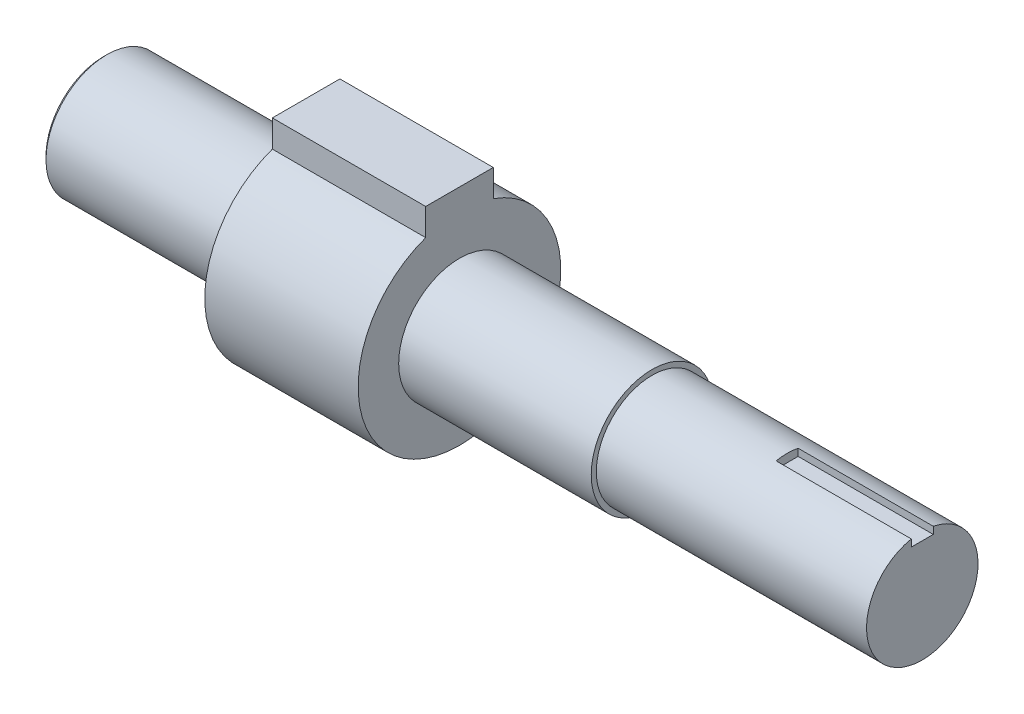
ISO-10303-21;
HEADER;
FILE_DESCRIPTION(('STEP AP214'),'2;1');
FILE_NAME('part.step','',(''),(''),'','','');
FILE_SCHEMA(('AUTOMOTIVE_DESIGN { 1 0 10303 214 1 1 1 1 }'));
ENDSEC;
DATA;
#1=APPLICATION_CONTEXT('core data for automotive mechanical design processes');
#2=APPLICATION_PROTOCOL_DEFINITION('international standard','automotive_design',2000,#1);
#3=PRODUCT_CONTEXT('',#1,'mechanical');
#4=PRODUCT('Part','Part','',(#3));
#5=PRODUCT_RELATED_PRODUCT_CATEGORY('part','',(#4));
#6=PRODUCT_DEFINITION_FORMATION('','',#4);
#7=PRODUCT_DEFINITION_CONTEXT('part definition',#1,'design');
#8=PRODUCT_DEFINITION('design','',#6,#7);
#9=PRODUCT_DEFINITION_SHAPE('','',#8);
#10=(LENGTH_UNIT() NAMED_UNIT(*) SI_UNIT(.MILLI.,.METRE.));
#11=(NAMED_UNIT(*) PLANE_ANGLE_UNIT() SI_UNIT($,.RADIAN.));
#12=(NAMED_UNIT(*) SI_UNIT($,.STERADIAN.) SOLID_ANGLE_UNIT());
#13=UNCERTAINTY_MEASURE_WITH_UNIT(LENGTH_MEASURE(1.E-05),#10,'distance_accuracy_value','');
#14=(GEOMETRIC_REPRESENTATION_CONTEXT(3) GLOBAL_UNCERTAINTY_ASSIGNED_CONTEXT((#13)) GLOBAL_UNIT_ASSIGNED_CONTEXT((#10,
#11,#12)) REPRESENTATION_CONTEXT('',''));
#15=CARTESIAN_POINT('',(0.,0.,0.));
#16=DIRECTION('',(0.,0.,1.));
#17=DIRECTION('',(1.,0.,0.));
#18=AXIS2_PLACEMENT_3D('',#15,#16,#17);
#19=CARTESIAN_POINT('',(0.,0.,0.));
#20=DIRECTION('',(1.,0.,0.));
#21=DIRECTION('',(0.,0.,-1.));
#22=AXIS2_PLACEMENT_3D('',#19,#20,#21);
#23=PLANE('',#22);
#24=CARTESIAN_POINT('',(0.,0.,0.));
#25=DIRECTION('',(1.,0.,0.));
#26=DIRECTION('',(0.,0.,-1.));
#27=AXIS2_PLACEMENT_3D('',#24,#25,#26);
#28=CIRCLE('',#27,8.49999999999998);
#29=CARTESIAN_POINT('',(0.,0.,-8.49999999999998));
#30=VERTEX_POINT('',#29);
#31=EDGE_CURVE('E55',#30,#30,#28,.F.);
#32=ORIENTED_EDGE('',*,*,#31,.T.);
#33=EDGE_LOOP('',(#32));
#34=FACE_BOUND('',#33,.T.);
#35=ADVANCED_FACE('F45',(#34),#23,.F.);
#36=CARTESIAN_POINT('',(0.,0.,0.));
#37=DIRECTION('',(-1.,0.,0.));
#38=DIRECTION('',(0.,0.,1.));
#39=AXIS2_PLACEMENT_3D('',#36,#37,#38);
#40=CYLINDRICAL_SURFACE('',#39,9.);
#41=CARTESIAN_POINT('',(0.500000000000023,0.,0.));
#42=DIRECTION('',(1.,0.,0.));
#43=DIRECTION('',(0.,0.,-1.));
#44=AXIS2_PLACEMENT_3D('',#41,#42,#43);
#45=CIRCLE('',#44,9.);
#46=CARTESIAN_POINT('',(0.500000000000023,0.,-9.));
#47=VERTEX_POINT('',#46);
#48=EDGE_CURVE('E11',#47,#47,#45,.T.);
#49=ORIENTED_EDGE('',*,*,#48,.T.);
#50=EDGE_LOOP('',(#49));
#51=FACE_BOUND('',#50,.T.);
#52=CARTESIAN_POINT('',(30.,0.,0.));
#53=DIRECTION('',(-1.,0.,0.));
#54=DIRECTION('',(0.,0.,1.));
#55=AXIS2_PLACEMENT_3D('',#52,#53,#54);
#56=CIRCLE('',#55,9.);
#57=CARTESIAN_POINT('',(30.,0.,9.));
#58=VERTEX_POINT('',#57);
#59=EDGE_CURVE('E173',#58,#58,#56,.T.);
#60=ORIENTED_EDGE('',*,*,#59,.T.);
#61=EDGE_LOOP('',(#60));
#62=FACE_BOUND('',#61,.T.);
#63=ADVANCED_FACE('F236',(#51,#62),#40,.T.);
#64=CARTESIAN_POINT('',(52.7,18.142135623731,5.));
#65=DIRECTION('',(0.,0.,-1.));
#66=DIRECTION('',(0.,1.,0.));
#67=AXIS2_PLACEMENT_3D('',#64,#65,#66);
#68=PLANE('',#67);
#69=DIRECTION('',(0.,-1.,0.));
#70=VECTOR('',#69,1.);
#71=CARTESIAN_POINT('',(30.,18.142135623731,5.));
#72=LINE('',#71,#70);
#73=CARTESIAN_POINT('',(30.,18.142135623731,5.));
#74=VERTEX_POINT('',#73);
#75=CARTESIAN_POINT('',(30.,14.1421356237309,5.));
#76=VERTEX_POINT('',#75);
#77=EDGE_CURVE('E178',#74,#76,#72,.T.);
#78=ORIENTED_EDGE('',*,*,#77,.T.);
#79=DIRECTION('',(-1.,0.,0.));
#80=VECTOR('',#79,1.);
#81=CARTESIAN_POINT('',(52.7,14.1421356237309,5.));
#82=LINE('',#81,#80);
#83=CARTESIAN_POINT('',(52.7,14.1421356237309,5.));
#84=VERTEX_POINT('',#83);
#85=EDGE_CURVE('E213',#84,#76,#82,.T.);
#86=ORIENTED_EDGE('',*,*,#85,.F.);
#87=DIRECTION('',(0.,-1.,0.));
#88=VECTOR('',#87,1.);
#89=CARTESIAN_POINT('',(52.7,18.142135623731,5.));
#90=LINE('',#89,#88);
#91=CARTESIAN_POINT('',(52.7,18.142135623731,5.));
#92=VERTEX_POINT('',#91);
#93=EDGE_CURVE('E182',#92,#84,#90,.T.);
#94=ORIENTED_EDGE('',*,*,#93,.F.);
#95=DIRECTION('',(-1.,0.,0.));
#96=VECTOR('',#95,1.);
#97=CARTESIAN_POINT('',(52.7,18.142135623731,5.));
#98=LINE('',#97,#96);
#99=EDGE_CURVE('E192',#92,#74,#98,.T.);
#100=ORIENTED_EDGE('',*,*,#99,.T.);
#101=EDGE_LOOP('',(#78,#86,#94,#100));
#102=FACE_BOUND('',#101,.T.);
#103=ADVANCED_FACE('F240',(#102),#68,.F.);
#104=CARTESIAN_POINT('',(52.7,0.,0.));
#105=DIRECTION('',(-1.,0.,0.));
#106=DIRECTION('',(0.,0.,1.));
#107=AXIS2_PLACEMENT_3D('',#104,#105,#106);
#108=CYLINDRICAL_SURFACE('',#107,15.);
#109=CARTESIAN_POINT('',(30.,0.,0.));
#110=DIRECTION('',(1.,0.,0.));
#111=DIRECTION('',(0.,0.,-1.));
#112=AXIS2_PLACEMENT_3D('',#109,#110,#111);
#113=CIRCLE('',#112,15.);
#114=CARTESIAN_POINT('',(30.,14.142135623731,-5.));
#115=VERTEX_POINT('',#114);
#116=EDGE_CURVE('E196',#76,#115,#113,.T.);
#117=ORIENTED_EDGE('',*,*,#116,.T.);
#118=DIRECTION('',(-1.,0.,0.));
#119=VECTOR('',#118,1.);
#120=CARTESIAN_POINT('',(52.7,14.142135623731,-5.));
#121=LINE('',#120,#119);
#122=CARTESIAN_POINT('',(52.7,14.142135623731,-5.));
#123=VERTEX_POINT('',#122);
#124=EDGE_CURVE('E209',#123,#115,#121,.T.);
#125=ORIENTED_EDGE('',*,*,#124,.F.);
#126=CARTESIAN_POINT('',(52.7,0.,0.));
#127=DIRECTION('',(1.,0.,0.));
#128=DIRECTION('',(0.,0.,-1.));
#129=AXIS2_PLACEMENT_3D('',#126,#127,#128);
#130=CIRCLE('',#129,15.);
#131=EDGE_CURVE('E100',#84,#123,#130,.T.);
#132=ORIENTED_EDGE('',*,*,#131,.F.);
#133=ORIENTED_EDGE('',*,*,#85,.T.);
#134=EDGE_LOOP('',(#117,#125,#132,#133));
#135=FACE_BOUND('',#134,.T.);
#136=ADVANCED_FACE('F246',(#135),#108,.T.);
#137=CARTESIAN_POINT('',(52.7,18.142135623731,-5.));
#138=DIRECTION('',(0.,0.,1.));
#139=DIRECTION('',(0.,-1.,0.));
#140=AXIS2_PLACEMENT_3D('',#137,#138,#139);
#141=PLANE('',#140);
#142=DIRECTION('',(0.,1.,0.));
#143=VECTOR('',#142,1.);
#144=CARTESIAN_POINT('',(30.,18.142135623731,-5.));
#145=LINE('',#144,#143);
#146=CARTESIAN_POINT('',(30.,18.142135623731,-5.));
#147=VERTEX_POINT('',#146);
#148=EDGE_CURVE('E199',#115,#147,#145,.T.);
#149=ORIENTED_EDGE('',*,*,#148,.T.);
#150=DIRECTION('',(-1.,0.,0.));
#151=VECTOR('',#150,1.);
#152=CARTESIAN_POINT('',(52.7,18.142135623731,-5.));
#153=LINE('',#152,#151);
#154=CARTESIAN_POINT('',(52.7,18.142135623731,-5.));
#155=VERTEX_POINT('',#154);
#156=EDGE_CURVE('E206',#155,#147,#153,.T.);
#157=ORIENTED_EDGE('',*,*,#156,.F.);
#158=DIRECTION('',(0.,1.,0.));
#159=VECTOR('',#158,1.);
#160=CARTESIAN_POINT('',(52.7,18.142135623731,-5.));
#161=LINE('',#160,#159);
#162=EDGE_CURVE('E187',#123,#155,#161,.T.);
#163=ORIENTED_EDGE('',*,*,#162,.F.);
#164=ORIENTED_EDGE('',*,*,#124,.T.);
#165=EDGE_LOOP('',(#149,#157,#163,#164));
#166=FACE_BOUND('',#165,.T.);
#167=ADVANCED_FACE('F250',(#166),#141,.F.);
#168=CARTESIAN_POINT('',(52.7,18.142135623731,5.));
#169=DIRECTION('',(0.,-1.,0.));
#170=DIRECTION('',(0.,0.,-1.));
#171=AXIS2_PLACEMENT_3D('',#168,#169,#170);
#172=PLANE('',#171);
#173=DIRECTION('',(0.,0.,1.));
#174=VECTOR('',#173,1.);
#175=CARTESIAN_POINT('',(30.,18.142135623731,5.));
#176=LINE('',#175,#174);
#177=EDGE_CURVE('E92',#147,#74,#176,.T.);
#178=ORIENTED_EDGE('',*,*,#177,.T.);
#179=ORIENTED_EDGE('',*,*,#99,.F.);
#180=DIRECTION('',(0.,0.,1.));
#181=VECTOR('',#180,1.);
#182=CARTESIAN_POINT('',(52.7,18.142135623731,5.));
#183=LINE('',#182,#181);
#184=EDGE_CURVE('E71',#155,#92,#183,.T.);
#185=ORIENTED_EDGE('',*,*,#184,.F.);
#186=ORIENTED_EDGE('',*,*,#156,.T.);
#187=EDGE_LOOP('',(#178,#179,#185,#186));
#188=FACE_BOUND('',#187,.T.);
#189=ADVANCED_FACE('F253',(#188),#172,.F.);
#190=CARTESIAN_POINT('',(52.7,0.,0.));
#191=DIRECTION('',(1.,0.,0.));
#192=DIRECTION('',(0.,0.,-1.));
#193=AXIS2_PLACEMENT_3D('',#190,#191,#192);
#194=PLANE('',#193);
#195=CARTESIAN_POINT('',(52.7,0.,0.));
#196=DIRECTION('',(1.,0.,0.));
#197=DIRECTION('',(0.,0.,-1.));
#198=AXIS2_PLACEMENT_3D('',#195,#196,#197);
#199=CIRCLE('',#198,9.);
#200=CARTESIAN_POINT('',(52.7,0.,9.));
#201=VERTEX_POINT('',#200);
#202=EDGE_CURVE('E168',#201,#201,#199,.T.);
#203=ORIENTED_EDGE('',*,*,#202,.F.);
#204=EDGE_LOOP('',(#203));
#205=FACE_BOUND('',#204,.T.);
#206=ORIENTED_EDGE('',*,*,#93,.T.);
#207=ORIENTED_EDGE('',*,*,#131,.T.);
#208=ORIENTED_EDGE('',*,*,#162,.T.);
#209=ORIENTED_EDGE('',*,*,#184,.T.);
#210=EDGE_LOOP('',(#206,#207,#208,#209));
#211=FACE_BOUND('',#210,.T.);
#212=ADVANCED_FACE('F257',(#205,#211),#194,.T.);
#213=CARTESIAN_POINT('',(30.,0.,0.));
#214=DIRECTION('',(1.,0.,0.));
#215=DIRECTION('',(0.,0.,-1.));
#216=AXIS2_PLACEMENT_3D('',#213,#214,#215);
#217=PLANE('',#216);
#218=ORIENTED_EDGE('',*,*,#59,.F.);
#219=EDGE_LOOP('',(#218));
#220=FACE_BOUND('',#219,.T.);
#221=ORIENTED_EDGE('',*,*,#77,.F.);
#222=ORIENTED_EDGE('',*,*,#177,.F.);
#223=ORIENTED_EDGE('',*,*,#148,.F.);
#224=ORIENTED_EDGE('',*,*,#116,.F.);
#225=EDGE_LOOP('',(#221,#222,#223,#224));
#226=FACE_BOUND('',#225,.T.);
#227=ADVANCED_FACE('F258',(#220,#226),#217,.F.);
#228=CARTESIAN_POINT('',(81.2,0.,0.));
#229=DIRECTION('',(-1.,0.,0.));
#230=DIRECTION('',(0.,0.,1.));
#231=AXIS2_PLACEMENT_3D('',#228,#229,#230);
#232=CYLINDRICAL_SURFACE('',#231,9.);
#233=CARTESIAN_POINT('',(81.2,0.,0.));
#234=DIRECTION('',(1.,0.,0.));
#235=DIRECTION('',(0.,0.,-1.));
#236=AXIS2_PLACEMENT_3D('',#233,#234,#235);
#237=CIRCLE('',#236,9.);
#238=CARTESIAN_POINT('',(81.2,0.,9.));
#239=VERTEX_POINT('',#238);
#240=EDGE_CURVE('E174',#239,#239,#237,.T.);
#241=CARTESIAN_POINT('',(81.2,0.,9.));
#242=CARTESIAN_POINT('',(80.903125,0.,9.));
#243=CARTESIAN_POINT('',(80.60625,0.,9.));
#244=CARTESIAN_POINT('',(80.0125,0.,9.));
#245=CARTESIAN_POINT('',(79.715625,0.,9.));
#246=CARTESIAN_POINT('',(79.121875,0.,9.));
#247=CARTESIAN_POINT('',(78.825,0.,9.));
#248=CARTESIAN_POINT('',(78.23125,0.,9.));
#249=CARTESIAN_POINT('',(77.934375,0.,9.));
#250=CARTESIAN_POINT('',(77.340625,0.,9.));
#251=CARTESIAN_POINT('',(77.04375,0.,9.));
#252=CARTESIAN_POINT('',(76.45,0.,9.));
#253=CARTESIAN_POINT('',(76.153125,0.,9.));
#254=CARTESIAN_POINT('',(75.559375,0.,9.));
#255=CARTESIAN_POINT('',(75.2625,0.,9.));
#256=CARTESIAN_POINT('',(74.66875,0.,9.));
#257=CARTESIAN_POINT('',(74.371875,0.,9.));
#258=CARTESIAN_POINT('',(73.778125,0.,9.));
#259=CARTESIAN_POINT('',(73.48125,0.,9.));
#260=CARTESIAN_POINT('',(72.8875,0.,9.));
#261=CARTESIAN_POINT('',(72.590625,0.,9.));
#262=CARTESIAN_POINT('',(71.996875,0.,9.));
#263=CARTESIAN_POINT('',(71.7,0.,9.));
#264=CARTESIAN_POINT('',(71.10625,0.,9.));
#265=CARTESIAN_POINT('',(70.809375,0.,9.));
#266=CARTESIAN_POINT('',(70.215625,0.,9.));
#267=CARTESIAN_POINT('',(69.91875,0.,9.));
#268=CARTESIAN_POINT('',(69.325,0.,9.));
#269=CARTESIAN_POINT('',(69.028125,0.,9.));
#270=CARTESIAN_POINT('',(68.434375,0.,9.));
#271=CARTESIAN_POINT('',(68.1375,0.,9.));
#272=CARTESIAN_POINT('',(67.54375,0.,9.));
#273=CARTESIAN_POINT('',(67.246875,0.,9.));
#274=CARTESIAN_POINT('',(66.653125,0.,9.));
#275=CARTESIAN_POINT('',(66.35625,0.,9.));
#276=CARTESIAN_POINT('',(65.7625,0.,9.));
#277=CARTESIAN_POINT('',(65.465625,0.,9.));
#278=CARTESIAN_POINT('',(64.871875,0.,9.));
#279=CARTESIAN_POINT('',(64.575,0.,9.));
#280=CARTESIAN_POINT('',(63.98125,0.,9.));
#281=CARTESIAN_POINT('',(63.684375,0.,9.));
#282=CARTESIAN_POINT('',(63.090625,0.,9.));
#283=CARTESIAN_POINT('',(62.79375,0.,9.));
#284=CARTESIAN_POINT('',(62.2,0.,9.));
#285=CARTESIAN_POINT('',(61.903125,0.,9.));
#286=CARTESIAN_POINT('',(61.309375,0.,9.));
#287=CARTESIAN_POINT('',(61.0125,0.,9.));
#288=CARTESIAN_POINT('',(60.41875,0.,9.));
#289=CARTESIAN_POINT('',(60.121875,0.,9.));
#290=CARTESIAN_POINT('',(59.528125,0.,9.));
#291=CARTESIAN_POINT('',(59.23125,0.,9.));
#292=CARTESIAN_POINT('',(58.6375,0.,9.));
#293=CARTESIAN_POINT('',(58.340625,0.,9.));
#294=CARTESIAN_POINT('',(57.746875,0.,9.));
#295=CARTESIAN_POINT('',(57.45,0.,9.));
#296=CARTESIAN_POINT('',(56.85625,0.,9.));
#297=CARTESIAN_POINT('',(56.559375,0.,9.));
#298=CARTESIAN_POINT('',(55.965625,0.,9.));
#299=CARTESIAN_POINT('',(55.66875,0.,9.));
#300=CARTESIAN_POINT('',(55.075,0.,9.));
#301=CARTESIAN_POINT('',(54.778125,0.,9.));
#302=CARTESIAN_POINT('',(54.184375,0.,9.));
#303=CARTESIAN_POINT('',(53.8875,0.,9.));
#304=CARTESIAN_POINT('',(53.29375,0.,9.));
#305=CARTESIAN_POINT('',(52.996875,0.,9.));
#306=CARTESIAN_POINT('',(52.7,0.,9.));
#307=B_SPLINE_CURVE_WITH_KNOTS('',3,(#241,#242,#243,#244,#245,#246,#247,#248,#249,#250,#251,
#252,#253,#254,#255,#256,#257,#258,#259,#260,#261,#262,#263,#264,#265,#266,#267,#268,#269,#270,
#271,#272,#273,#274,#275,#276,#277,#278,#279,#280,#281,#282,#283,#284,#285,#286,#287,#288,#289,
#290,#291,#292,#293,#294,#295,#296,#297,#298,#299,#300,#301,#302,#303,#304,#305,#306),
.UNSPECIFIED.,.F.,.F.,(4,2,2,2,2,2,2,2,2,2,2,2,2,2,2,2,2,2,2,2,2,2,2,2,2,2,2,2,2,2,2,2,4),(0.,
0.890625000000006,1.78125000000001,2.671875,3.56250000000001,4.453125,5.34375000000001,6.234375,
7.12500000000001,8.015625,8.90625,9.79687500000001,10.6875,11.578125,12.46875,13.359375,14.25,
15.140625,16.03125,16.921875,17.8125,18.703125,19.59375,20.484375,21.375,22.265625,23.15625,
24.046875,24.9375,25.828125,26.71875,27.609375,28.5),.UNSPECIFIED.);
#308=EDGE_CURVE('BSEAM261',#239,#201,#307,.T.);
#309=ORIENTED_EDGE('',*,*,#240,.F.);
#310=ORIENTED_EDGE('',*,*,#202,.T.);
#311=ORIENTED_EDGE('',*,*,#308,.T.);
#312=ORIENTED_EDGE('',*,*,#308,.F.);
#313=EDGE_LOOP('',(#309,#311,#310,#312));
#314=FACE_BOUND('',#313,.T.);
#315=ADVANCED_FACE('F261',(#314),#232,.T.);
#316=CARTESIAN_POINT('',(81.2,0.,0.));
#317=DIRECTION('',(1.,0.,0.));
#318=DIRECTION('',(0.,0.,-1.));
#319=AXIS2_PLACEMENT_3D('',#316,#317,#318);
#320=PLANE('',#319);
#321=CARTESIAN_POINT('',(81.2,0.,0.));
#322=DIRECTION('',(1.,0.,0.));
#323=DIRECTION('',(0.,0.,-1.));
#324=AXIS2_PLACEMENT_3D('',#321,#322,#323);
#325=CIRCLE('',#324,8.25);
#326=CARTESIAN_POINT('',(81.2,0.,-8.25));
#327=VERTEX_POINT('',#326);
#328=EDGE_CURVE('E169',#327,#327,#325,.T.);
#329=ORIENTED_EDGE('',*,*,#328,.F.);
#330=EDGE_LOOP('',(#329));
#331=FACE_BOUND('',#330,.T.);
#332=ORIENTED_EDGE('',*,*,#240,.T.);
#333=EDGE_LOOP('',(#332));
#334=FACE_BOUND('',#333,.T.);
#335=ADVANCED_FACE('F268',(#331,#334),#320,.T.);
#336=CARTESIAN_POINT('',(121.2,0.,0.));
#337=DIRECTION('',(-1.,0.,0.));
#338=DIRECTION('',(0.,0.,1.));
#339=AXIS2_PLACEMENT_3D('',#336,#337,#338);
#340=CYLINDRICAL_SURFACE('',#339,8.25);
#341=CARTESIAN_POINT('',(121.2,0.,0.));
#342=DIRECTION('',(1.,0.,0.));
#343=DIRECTION('',(0.,0.,-1.));
#344=AXIS2_PLACEMENT_3D('',#341,#342,#343);
#345=CIRCLE('',#344,8.25);
#346=CARTESIAN_POINT('',(121.2,8.08837900941839,1.625));
#347=VERTEX_POINT('',#346);
#348=CARTESIAN_POINT('',(121.2,8.08837900941839,-1.625));
#349=VERTEX_POINT('',#348);
#350=EDGE_CURVE('E164',#347,#349,#345,.T.);
#351=ORIENTED_EDGE('',*,*,#350,.F.);
#352=DIRECTION('',(-1.,0.,0.));
#353=VECTOR('',#352,1.);
#354=CARTESIAN_POINT('',(121.2,8.08837900941839,1.625));
#355=LINE('',#354,#353);
#356=CARTESIAN_POINT('',(101.2,8.08837900941839,1.625));
#357=VERTEX_POINT('',#356);
#358=EDGE_CURVE('E161',#347,#357,#355,.T.);
#359=ORIENTED_EDGE('',*,*,#358,.T.);
#360=CARTESIAN_POINT('',(101.2,0.,0.));
#361=DIRECTION('',(1.,0.,0.));
#362=DIRECTION('',(0.,0.,-1.));
#363=AXIS2_PLACEMENT_3D('',#360,#361,#362);
#364=CIRCLE('',#363,8.25);
#365=CARTESIAN_POINT('',(101.2,8.08837900941839,-1.625));
#366=VERTEX_POINT('',#365);
#367=EDGE_CURVE('E129',#366,#357,#364,.T.);
#368=ORIENTED_EDGE('',*,*,#367,.F.);
#369=DIRECTION('',(-1.,0.,0.));
#370=VECTOR('',#369,1.);
#371=CARTESIAN_POINT('',(121.2,8.08837900941839,-1.625));
#372=LINE('',#371,#370);
#373=EDGE_CURVE('E156',#366,#349,#372,.F.);
#374=ORIENTED_EDGE('',*,*,#373,.T.);
#375=EDGE_LOOP('',(#351,#359,#368,#374));
#376=FACE_BOUND('',#375,.T.);
#377=ORIENTED_EDGE('',*,*,#328,.T.);
#378=EDGE_LOOP('',(#377));
#379=FACE_BOUND('',#378,.T.);
#380=ADVANCED_FACE('F272',(#376,#379),#340,.T.);
#381=CARTESIAN_POINT('',(121.2,0.,0.));
#382=DIRECTION('',(1.,0.,0.));
#383=DIRECTION('',(0.,0.,-1.));
#384=AXIS2_PLACEMENT_3D('',#381,#382,#383);
#385=PLANE('',#384);
#386=DIRECTION('',(0.,-1.,0.));
#387=VECTOR('',#386,1.);
#388=CARTESIAN_POINT('',(121.2,0.,1.625));
#389=LINE('',#388,#387);
#390=CARTESIAN_POINT('',(121.2,7.04,1.625));
#391=VERTEX_POINT('',#390);
#392=EDGE_CURVE('E137',#347,#391,#389,.T.);
#393=ORIENTED_EDGE('',*,*,#392,.F.);
#394=ORIENTED_EDGE('',*,*,#350,.T.);
#395=DIRECTION('',(0.,1.,0.));
#396=VECTOR('',#395,1.);
#397=CARTESIAN_POINT('',(121.2,8.54,-1.625));
#398=LINE('',#397,#396);
#399=CARTESIAN_POINT('',(121.2,7.04,-1.625));
#400=VERTEX_POINT('',#399);
#401=EDGE_CURVE('E133',#400,#349,#398,.T.);
#402=ORIENTED_EDGE('',*,*,#401,.F.);
#403=DIRECTION('',(0.,0.,-1.));
#404=VECTOR('',#403,1.);
#405=CARTESIAN_POINT('',(121.2,7.04,1.625));
#406=LINE('',#405,#404);
#407=EDGE_CURVE('E150',#391,#400,#406,.T.);
#408=ORIENTED_EDGE('',*,*,#407,.F.);
#409=EDGE_LOOP('',(#393,#394,#402,#408));
#410=FACE_BOUND('',#409,.T.);
#411=ADVANCED_FACE('F276',(#410),#385,.T.);
#412=CARTESIAN_POINT('',(101.2,0.,0.));
#413=DIRECTION('',(1.,0.,0.));
#414=DIRECTION('',(0.,0.,-1.));
#415=AXIS2_PLACEMENT_3D('',#412,#413,#414);
#416=PLANE('',#415);
#417=ORIENTED_EDGE('',*,*,#367,.T.);
#418=DIRECTION('',(0.,-1.,0.));
#419=VECTOR('',#418,1.);
#420=CARTESIAN_POINT('',(101.2,8.54,1.625));
#421=LINE('',#420,#419);
#422=CARTESIAN_POINT('',(101.2,7.04,1.625));
#423=VERTEX_POINT('',#422);
#424=EDGE_CURVE('E124',#357,#423,#421,.T.);
#425=ORIENTED_EDGE('',*,*,#424,.T.);
#426=DIRECTION('',(0.,0.,-1.));
#427=VECTOR('',#426,1.);
#428=CARTESIAN_POINT('',(101.2,7.04,1.625));
#429=LINE('',#428,#427);
#430=CARTESIAN_POINT('',(101.2,7.04,-1.625));
#431=VERTEX_POINT('',#430);
#432=EDGE_CURVE('E127',#423,#431,#429,.T.);
#433=ORIENTED_EDGE('',*,*,#432,.T.);
#434=DIRECTION('',(0.,1.,0.));
#435=VECTOR('',#434,1.);
#436=CARTESIAN_POINT('',(101.2,8.54,-1.625));
#437=LINE('',#436,#435);
#438=EDGE_CURVE('E141',#431,#366,#437,.T.);
#439=ORIENTED_EDGE('',*,*,#438,.T.);
#440=EDGE_LOOP('',(#417,#425,#433,#439));
#441=FACE_BOUND('',#440,.T.);
#442=ADVANCED_FACE('F125',(#441),#416,.T.);
#443=CARTESIAN_POINT('',(101.2,8.54,1.625));
#444=DIRECTION('',(0.,0.,1.));
#445=DIRECTION('',(0.,-1.,0.));
#446=AXIS2_PLACEMENT_3D('',#443,#444,#445);
#447=PLANE('',#446);
#448=ORIENTED_EDGE('',*,*,#392,.T.);
#449=DIRECTION('',(1.,0.,0.));
#450=VECTOR('',#449,1.);
#451=CARTESIAN_POINT('',(101.2,7.04,1.625));
#452=LINE('',#451,#450);
#453=EDGE_CURVE('E62',#423,#391,#452,.T.);
#454=ORIENTED_EDGE('',*,*,#453,.F.);
#455=ORIENTED_EDGE('',*,*,#424,.F.);
#456=ORIENTED_EDGE('',*,*,#358,.F.);
#457=EDGE_LOOP('',(#448,#454,#455,#456));
#458=FACE_BOUND('',#457,.T.);
#459=ADVANCED_FACE('F135',(#458),#447,.F.);
#460=CARTESIAN_POINT('',(101.2,8.54,-1.625));
#461=DIRECTION('',(0.,0.,-1.));
#462=DIRECTION('',(-1.,0.,0.));
#463=AXIS2_PLACEMENT_3D('',#460,#461,#462);
#464=PLANE('',#463);
#465=ORIENTED_EDGE('',*,*,#438,.F.);
#466=DIRECTION('',(1.,0.,0.));
#467=VECTOR('',#466,1.);
#468=CARTESIAN_POINT('',(101.2,7.04,-1.625));
#469=LINE('',#468,#467);
#470=EDGE_CURVE('E140',#431,#400,#469,.T.);
#471=ORIENTED_EDGE('',*,*,#470,.T.);
#472=ORIENTED_EDGE('',*,*,#401,.T.);
#473=ORIENTED_EDGE('',*,*,#373,.F.);
#474=EDGE_LOOP('',(#465,#471,#472,#473));
#475=FACE_BOUND('',#474,.T.);
#476=ADVANCED_FACE('F232',(#475),#464,.F.);
#477=CARTESIAN_POINT('',(101.2,7.04,1.625));
#478=DIRECTION('',(0.,-1.,0.));
#479=DIRECTION('',(0.,0.,-1.));
#480=AXIS2_PLACEMENT_3D('',#477,#478,#479);
#481=PLANE('',#480);
#482=ORIENTED_EDGE('',*,*,#407,.T.);
#483=ORIENTED_EDGE('',*,*,#470,.F.);
#484=ORIENTED_EDGE('',*,*,#432,.F.);
#485=ORIENTED_EDGE('',*,*,#453,.T.);
#486=EDGE_LOOP('',(#482,#483,#484,#485));
#487=FACE_BOUND('',#486,.T.);
#488=ADVANCED_FACE('F143',(#487),#481,.F.);
#489=CARTESIAN_POINT('',(0.,0.,0.));
#490=DIRECTION('',(1.,0.,0.));
#491=DIRECTION('',(0.,0.,-1.));
#492=AXIS2_PLACEMENT_3D('',#489,#490,#491);
#493=CONICAL_SURFACE('',#492,8.49999999999998,0.785398163397445);
#494=ORIENTED_EDGE('',*,*,#48,.F.);
#495=EDGE_LOOP('',(#494));
#496=FACE_BOUND('',#495,.T.);
#497=ORIENTED_EDGE('',*,*,#31,.F.);
#498=EDGE_LOOP('',(#497));
#499=FACE_BOUND('',#498,.T.);
#500=ADVANCED_FACE('F48',(#496,#499),#493,.T.);
#501=CLOSED_SHELL('',(#35,#63,#103,#136,#167,#189,#212,#227,#315,#335,#380,#411,#442,#459,#476,
#488,#500));
#502=MANIFOLD_SOLID_BREP('B2',#501);
#503=ADVANCED_BREP_SHAPE_REPRESENTATION('',(#18,#502),#14);
#504=SHAPE_DEFINITION_REPRESENTATION(#9,#503);
ENDSEC;
END-ISO-10303-21;
